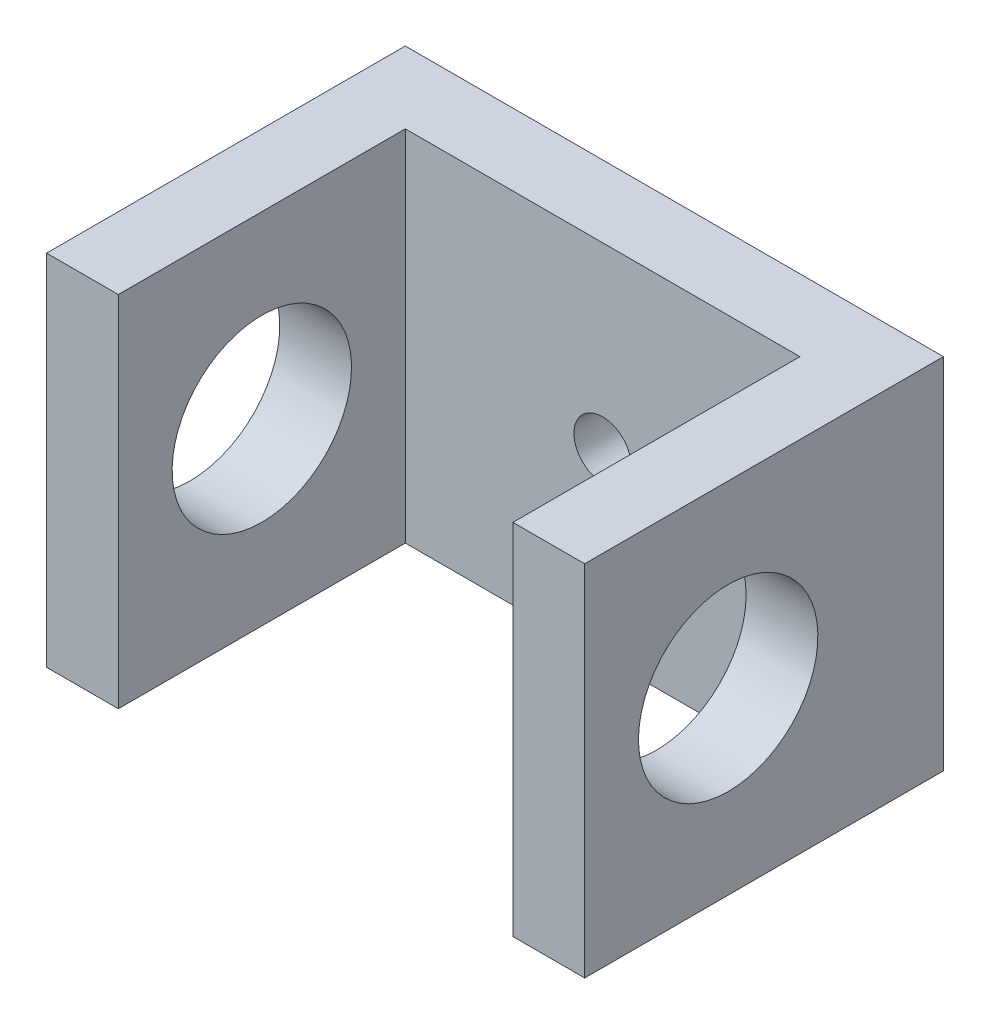
ISO-10303-21;
HEADER;
FILE_DESCRIPTION(('STEP AP214'),'2;1');
FILE_NAME('part.step','',(''),(''),'','','');
FILE_SCHEMA(('AUTOMOTIVE_DESIGN { 1 0 10303 214 1 1 1 1 }'));
ENDSEC;
DATA;
#1=APPLICATION_CONTEXT('core data for automotive mechanical design processes');
#2=APPLICATION_PROTOCOL_DEFINITION('international standard','automotive_design',2000,#1);
#3=PRODUCT_CONTEXT('',#1,'mechanical');
#4=PRODUCT('Part','Part','',(#3));
#5=PRODUCT_RELATED_PRODUCT_CATEGORY('part','',(#4));
#6=PRODUCT_DEFINITION_FORMATION('','',#4);
#7=PRODUCT_DEFINITION_CONTEXT('part definition',#1,'design');
#8=PRODUCT_DEFINITION('design','',#6,#7);
#9=PRODUCT_DEFINITION_SHAPE('','',#8);
#10=(LENGTH_UNIT() NAMED_UNIT(*) SI_UNIT(.MILLI.,.METRE.));
#11=(NAMED_UNIT(*) PLANE_ANGLE_UNIT() SI_UNIT($,.RADIAN.));
#12=(NAMED_UNIT(*) SI_UNIT($,.STERADIAN.) SOLID_ANGLE_UNIT());
#13=UNCERTAINTY_MEASURE_WITH_UNIT(LENGTH_MEASURE(1.E-05),#10,'distance_accuracy_value','');
#14=(GEOMETRIC_REPRESENTATION_CONTEXT(3) GLOBAL_UNCERTAINTY_ASSIGNED_CONTEXT((#13)) GLOBAL_UNIT_ASSIGNED_CONTEXT((#10,
#11,#12)) REPRESENTATION_CONTEXT('',''));
#15=CARTESIAN_POINT('',(0.,0.,0.));
#16=DIRECTION('',(0.,0.,1.));
#17=DIRECTION('',(1.,0.,0.));
#18=AXIS2_PLACEMENT_3D('',#15,#16,#17);
#19=CARTESIAN_POINT('',(0.,0.,2.));
#20=DIRECTION('',(0.,0.,1.));
#21=DIRECTION('',(1.,0.,0.));
#22=AXIS2_PLACEMENT_3D('',#19,#20,#21);
#23=PLANE('',#22);
#24=CARTESIAN_POINT('',(0.,0.,2.));
#25=DIRECTION('',(0.,0.,1.));
#26=DIRECTION('',(1.,0.,0.));
#27=AXIS2_PLACEMENT_3D('',#24,#25,#26);
#28=CIRCLE('',#27,0.8);
#29=CARTESIAN_POINT('',(0.8,0.,2.));
#30=VERTEX_POINT('',#29);
#31=EDGE_CURVE('E321',#30,#30,#28,.T.);
#32=ORIENTED_EDGE('',*,*,#31,.F.);
#33=EDGE_LOOP('',(#32));
#34=FACE_BOUND('',#33,.T.);
#35=DIRECTION('',(1.,0.,0.));
#36=VECTOR('',#35,1.);
#37=CARTESIAN_POINT('',(-7.5,-5.,2.));
#38=LINE('',#37,#36);
#39=CARTESIAN_POINT('',(-5.5,-5.,2.));
#40=VERTEX_POINT('',#39);
#41=CARTESIAN_POINT('',(5.5,-5.,2.));
#42=VERTEX_POINT('',#41);
#43=EDGE_CURVE('E53',#40,#42,#38,.T.);
#44=ORIENTED_EDGE('',*,*,#43,.T.);
#45=DIRECTION('',(0.,-1.,0.));
#46=VECTOR('',#45,1.);
#47=CARTESIAN_POINT('',(5.5,-5.,2.));
#48=LINE('',#47,#46);
#49=CARTESIAN_POINT('',(5.5,5.,2.));
#50=VERTEX_POINT('',#49);
#51=EDGE_CURVE('E48',#50,#42,#48,.T.);
#52=ORIENTED_EDGE('',*,*,#51,.F.);
#53=DIRECTION('',(-1.,0.,0.));
#54=VECTOR('',#53,1.);
#55=CARTESIAN_POINT('',(-7.5,5.,2.));
#56=LINE('',#55,#54);
#57=CARTESIAN_POINT('',(-5.5,5.,2.));
#58=VERTEX_POINT('',#57);
#59=EDGE_CURVE('E147',#50,#58,#56,.T.);
#60=ORIENTED_EDGE('',*,*,#59,.T.);
#61=DIRECTION('',(0.,1.,0.));
#62=VECTOR('',#61,1.);
#63=CARTESIAN_POINT('',(-5.5,-5.,2.));
#64=LINE('',#63,#62);
#65=EDGE_CURVE('E128',#40,#58,#64,.T.);
#66=ORIENTED_EDGE('',*,*,#65,.F.);
#67=EDGE_LOOP('',(#44,#52,#60,#66));
#68=FACE_BOUND('',#67,.T.);
#69=ADVANCED_FACE('F32',(#34,#68),#23,.T.);
#70=CARTESIAN_POINT('',(7.5,5.,2.));
#71=DIRECTION('',(-1.,0.,0.));
#72=DIRECTION('',(0.,-1.,0.));
#73=AXIS2_PLACEMENT_3D('',#70,#71,#72);
#74=PLANE('',#73);
#75=CARTESIAN_POINT('',(7.5,0.,6.));
#76=DIRECTION('',(-1.,0.,0.));
#77=DIRECTION('',(0.,-1.,0.));
#78=AXIS2_PLACEMENT_3D('',#75,#76,#77);
#79=CIRCLE('',#78,2.5);
#80=CARTESIAN_POINT('',(7.5,-2.5,6.));
#81=VERTEX_POINT('',#80);
#82=EDGE_CURVE('E326',#81,#81,#79,.T.);
#83=ORIENTED_EDGE('',*,*,#82,.T.);
#84=EDGE_LOOP('',(#83));
#85=FACE_BOUND('',#84,.T.);
#86=DIRECTION('',(0.,1.,0.));
#87=VECTOR('',#86,1.);
#88=CARTESIAN_POINT('',(7.5,5.,0.));
#89=LINE('',#88,#87);
#90=CARTESIAN_POINT('',(7.5,-5.,0.));
#91=VERTEX_POINT('',#90);
#92=CARTESIAN_POINT('',(7.5,5.,0.));
#93=VERTEX_POINT('',#92);
#94=EDGE_CURVE('E101',#91,#93,#89,.T.);
#95=ORIENTED_EDGE('',*,*,#94,.T.);
#96=DIRECTION('',(0.,0.,-1.));
#97=VECTOR('',#96,1.);
#98=CARTESIAN_POINT('',(7.5,5.,2.));
#99=LINE('',#98,#97);
#100=CARTESIAN_POINT('',(7.5,5.,10.));
#101=VERTEX_POINT('',#100);
#102=EDGE_CURVE('E11',#101,#93,#99,.T.);
#103=ORIENTED_EDGE('',*,*,#102,.F.);
#104=DIRECTION('',(0.,1.,0.));
#105=VECTOR('',#104,1.);
#106=CARTESIAN_POINT('',(7.5,-5.,10.));
#107=LINE('',#106,#105);
#108=CARTESIAN_POINT('',(7.5,-5.,10.));
#109=VERTEX_POINT('',#108);
#110=EDGE_CURVE('E99',#109,#101,#107,.T.);
#111=ORIENTED_EDGE('',*,*,#110,.F.);
#112=DIRECTION('',(0.,0.,-1.));
#113=VECTOR('',#112,1.);
#114=CARTESIAN_POINT('',(7.5,-5.,2.));
#115=LINE('',#114,#113);
#116=EDGE_CURVE('E151',#109,#91,#115,.T.);
#117=ORIENTED_EDGE('',*,*,#116,.T.);
#118=EDGE_LOOP('',(#95,#103,#111,#117));
#119=FACE_BOUND('',#118,.T.);
#120=ADVANCED_FACE('F34',(#85,#119),#74,.F.);
#121=CARTESIAN_POINT('',(-7.5,5.,2.));
#122=DIRECTION('',(0.,-1.,0.));
#123=DIRECTION('',(0.,0.,-1.));
#124=AXIS2_PLACEMENT_3D('',#121,#122,#123);
#125=PLANE('',#124);
#126=DIRECTION('',(-1.,0.,0.));
#127=VECTOR('',#126,1.);
#128=CARTESIAN_POINT('',(-7.5,5.,0.));
#129=LINE('',#128,#127);
#130=CARTESIAN_POINT('',(-7.5,5.,0.));
#131=VERTEX_POINT('',#130);
#132=EDGE_CURVE('E153',#93,#131,#129,.T.);
#133=ORIENTED_EDGE('',*,*,#132,.T.);
#134=DIRECTION('',(0.,0.,-1.));
#135=VECTOR('',#134,1.);
#136=CARTESIAN_POINT('',(-7.5,5.,2.));
#137=LINE('',#136,#135);
#138=CARTESIAN_POINT('',(-7.5,5.,10.));
#139=VERTEX_POINT('',#138);
#140=EDGE_CURVE('E41',#139,#131,#137,.T.);
#141=ORIENTED_EDGE('',*,*,#140,.F.);
#142=DIRECTION('',(-1.,0.,0.));
#143=VECTOR('',#142,1.);
#144=CARTESIAN_POINT('',(-7.5,5.,10.));
#145=LINE('',#144,#143);
#146=CARTESIAN_POINT('',(-5.5,5.,10.));
#147=VERTEX_POINT('',#146);
#148=EDGE_CURVE('E136',#147,#139,#145,.T.);
#149=ORIENTED_EDGE('',*,*,#148,.F.);
#150=DIRECTION('',(0.,0.,-1.));
#151=VECTOR('',#150,1.);
#152=CARTESIAN_POINT('',(-5.5,5.,10.));
#153=LINE('',#152,#151);
#154=EDGE_CURVE('E139',#147,#58,#153,.T.);
#155=ORIENTED_EDGE('',*,*,#154,.T.);
#156=ORIENTED_EDGE('',*,*,#59,.F.);
#157=DIRECTION('',(0.,0.,-1.));
#158=VECTOR('',#157,1.);
#159=CARTESIAN_POINT('',(5.5,5.,10.));
#160=LINE('',#159,#158);
#161=CARTESIAN_POINT('',(5.5,5.,10.));
#162=VERTEX_POINT('',#161);
#163=EDGE_CURVE('E107',#162,#50,#160,.T.);
#164=ORIENTED_EDGE('',*,*,#163,.F.);
#165=DIRECTION('',(-1.,0.,0.));
#166=VECTOR('',#165,1.);
#167=CARTESIAN_POINT('',(7.5,5.,10.));
#168=LINE('',#167,#166);
#169=EDGE_CURVE('E104',#101,#162,#168,.T.);
#170=ORIENTED_EDGE('',*,*,#169,.F.);
#171=ORIENTED_EDGE('',*,*,#102,.T.);
#172=EDGE_LOOP('',(#133,#141,#149,#155,#156,#164,#170,#171));
#173=FACE_BOUND('',#172,.T.);
#174=ADVANCED_FACE('F105',(#173),#125,.F.);
#175=CARTESIAN_POINT('',(-7.5,5.,2.));
#176=DIRECTION('',(1.,0.,0.));
#177=DIRECTION('',(0.,1.,0.));
#178=AXIS2_PLACEMENT_3D('',#175,#176,#177);
#179=PLANE('',#178);
#180=CARTESIAN_POINT('',(-7.5,0.,6.));
#181=DIRECTION('',(-1.,0.,0.));
#182=DIRECTION('',(0.,-1.,0.));
#183=AXIS2_PLACEMENT_3D('',#180,#181,#182);
#184=CIRCLE('',#183,2.5);
#185=CARTESIAN_POINT('',(-7.5,-2.5,6.));
#186=VERTEX_POINT('',#185);
#187=EDGE_CURVE('E323',#186,#186,#184,.T.);
#188=ORIENTED_EDGE('',*,*,#187,.F.);
#189=EDGE_LOOP('',(#188));
#190=FACE_BOUND('',#189,.T.);
#191=DIRECTION('',(0.,-1.,0.));
#192=VECTOR('',#191,1.);
#193=CARTESIAN_POINT('',(-7.5,5.,0.));
#194=LINE('',#193,#192);
#195=CARTESIAN_POINT('',(-7.5,-5.,0.));
#196=VERTEX_POINT('',#195);
#197=EDGE_CURVE('E155',#131,#196,#194,.T.);
#198=ORIENTED_EDGE('',*,*,#197,.T.);
#199=DIRECTION('',(0.,0.,-1.));
#200=VECTOR('',#199,1.);
#201=CARTESIAN_POINT('',(-7.5,-5.,2.));
#202=LINE('',#201,#200);
#203=CARTESIAN_POINT('',(-7.5,-5.,10.));
#204=VERTEX_POINT('',#203);
#205=EDGE_CURVE('E159',#204,#196,#202,.T.);
#206=ORIENTED_EDGE('',*,*,#205,.F.);
#207=DIRECTION('',(0.,-1.,0.));
#208=VECTOR('',#207,1.);
#209=CARTESIAN_POINT('',(-7.5,-5.,10.));
#210=LINE('',#209,#208);
#211=EDGE_CURVE('E129',#139,#204,#210,.T.);
#212=ORIENTED_EDGE('',*,*,#211,.F.);
#213=ORIENTED_EDGE('',*,*,#140,.T.);
#214=EDGE_LOOP('',(#198,#206,#212,#213));
#215=FACE_BOUND('',#214,.T.);
#216=ADVANCED_FACE('F166',(#190,#215),#179,.F.);
#217=CARTESIAN_POINT('',(-7.5,-5.,2.));
#218=DIRECTION('',(0.,1.,0.));
#219=DIRECTION('',(0.,0.,1.));
#220=AXIS2_PLACEMENT_3D('',#217,#218,#219);
#221=PLANE('',#220);
#222=DIRECTION('',(1.,0.,0.));
#223=VECTOR('',#222,1.);
#224=CARTESIAN_POINT('',(-7.5,-5.,0.));
#225=LINE('',#224,#223);
#226=EDGE_CURVE('E149',#196,#91,#225,.T.);
#227=ORIENTED_EDGE('',*,*,#226,.T.);
#228=ORIENTED_EDGE('',*,*,#116,.F.);
#229=DIRECTION('',(1.,0.,0.));
#230=VECTOR('',#229,1.);
#231=CARTESIAN_POINT('',(7.5,-5.,10.));
#232=LINE('',#231,#230);
#233=CARTESIAN_POINT('',(5.5,-5.,10.));
#234=VERTEX_POINT('',#233);
#235=EDGE_CURVE('E115',#234,#109,#232,.T.);
#236=ORIENTED_EDGE('',*,*,#235,.F.);
#237=DIRECTION('',(0.,0.,-1.));
#238=VECTOR('',#237,1.);
#239=CARTESIAN_POINT('',(5.5,-5.,10.));
#240=LINE('',#239,#238);
#241=EDGE_CURVE('E123',#234,#42,#240,.T.);
#242=ORIENTED_EDGE('',*,*,#241,.T.);
#243=ORIENTED_EDGE('',*,*,#43,.F.);
#244=DIRECTION('',(0.,0.,-1.));
#245=VECTOR('',#244,1.);
#246=CARTESIAN_POINT('',(-5.5,-5.,10.));
#247=LINE('',#246,#245);
#248=CARTESIAN_POINT('',(-5.5,-5.,10.));
#249=VERTEX_POINT('',#248);
#250=EDGE_CURVE('E144',#249,#40,#247,.T.);
#251=ORIENTED_EDGE('',*,*,#250,.F.);
#252=DIRECTION('',(1.,0.,0.));
#253=VECTOR('',#252,1.);
#254=CARTESIAN_POINT('',(-7.5,-5.,10.));
#255=LINE('',#254,#253);
#256=EDGE_CURVE('E132',#204,#249,#255,.T.);
#257=ORIENTED_EDGE('',*,*,#256,.F.);
#258=ORIENTED_EDGE('',*,*,#205,.T.);
#259=EDGE_LOOP('',(#227,#228,#236,#242,#243,#251,#257,#258));
#260=FACE_BOUND('',#259,.T.);
#261=ADVANCED_FACE('F172',(#260),#221,.F.);
#262=CARTESIAN_POINT('',(0.,0.,0.));
#263=DIRECTION('',(0.,0.,1.));
#264=DIRECTION('',(1.,0.,0.));
#265=AXIS2_PLACEMENT_3D('',#262,#263,#264);
#266=PLANE('',#265);
#267=CARTESIAN_POINT('',(0.,0.,0.));
#268=DIRECTION('',(0.,0.,1.));
#269=DIRECTION('',(1.,0.,0.));
#270=AXIS2_PLACEMENT_3D('',#267,#268,#269);
#271=CIRCLE('',#270,0.8);
#272=CARTESIAN_POINT('',(0.8,0.,0.));
#273=VERTEX_POINT('',#272);
#274=EDGE_CURVE('E319',#273,#273,#271,.T.);
#275=ORIENTED_EDGE('',*,*,#274,.T.);
#276=EDGE_LOOP('',(#275));
#277=FACE_BOUND('',#276,.T.);
#278=ORIENTED_EDGE('',*,*,#94,.F.);
#279=ORIENTED_EDGE('',*,*,#226,.F.);
#280=ORIENTED_EDGE('',*,*,#197,.F.);
#281=ORIENTED_EDGE('',*,*,#132,.F.);
#282=EDGE_LOOP('',(#278,#279,#280,#281));
#283=FACE_BOUND('',#282,.T.);
#284=ADVANCED_FACE('F170',(#277,#283),#266,.F.);
#285=CARTESIAN_POINT('',(-5.5,-5.,10.));
#286=DIRECTION('',(-1.,0.,0.));
#287=DIRECTION('',(0.,-1.,0.));
#288=AXIS2_PLACEMENT_3D('',#285,#286,#287);
#289=PLANE('',#288);
#290=CARTESIAN_POINT('',(-5.5,0.,6.));
#291=DIRECTION('',(-1.,0.,0.));
#292=DIRECTION('',(0.,-1.,0.));
#293=AXIS2_PLACEMENT_3D('',#290,#291,#292);
#294=CIRCLE('',#293,2.5);
#295=CARTESIAN_POINT('',(-5.5,-2.5,6.));
#296=VERTEX_POINT('',#295);
#297=EDGE_CURVE('E117',#296,#296,#294,.T.);
#298=ORIENTED_EDGE('',*,*,#297,.T.);
#299=EDGE_LOOP('',(#298));
#300=FACE_BOUND('',#299,.T.);
#301=ORIENTED_EDGE('',*,*,#65,.T.);
#302=ORIENTED_EDGE('',*,*,#154,.F.);
#303=DIRECTION('',(0.,1.,0.));
#304=VECTOR('',#303,1.);
#305=CARTESIAN_POINT('',(-5.5,-5.,10.));
#306=LINE('',#305,#304);
#307=EDGE_CURVE('E134',#249,#147,#306,.T.);
#308=ORIENTED_EDGE('',*,*,#307,.F.);
#309=ORIENTED_EDGE('',*,*,#250,.T.);
#310=EDGE_LOOP('',(#301,#302,#308,#309));
#311=FACE_BOUND('',#310,.T.);
#312=ADVANCED_FACE('F180',(#300,#311),#289,.F.);
#313=CARTESIAN_POINT('',(0.,0.,10.));
#314=DIRECTION('',(0.,0.,-1.));
#315=DIRECTION('',(-1.,0.,0.));
#316=AXIS2_PLACEMENT_3D('',#313,#314,#315);
#317=PLANE('',#316);
#318=ORIENTED_EDGE('',*,*,#211,.T.);
#319=ORIENTED_EDGE('',*,*,#256,.T.);
#320=ORIENTED_EDGE('',*,*,#307,.T.);
#321=ORIENTED_EDGE('',*,*,#148,.T.);
#322=EDGE_LOOP('',(#318,#319,#320,#321));
#323=FACE_BOUND('',#322,.T.);
#324=ADVANCED_FACE('F177',(#323),#317,.F.);
#325=CARTESIAN_POINT('',(5.5,-5.,10.));
#326=DIRECTION('',(1.,0.,0.));
#327=DIRECTION('',(0.,0.,-1.));
#328=AXIS2_PLACEMENT_3D('',#325,#326,#327);
#329=PLANE('',#328);
#330=CARTESIAN_POINT('',(5.5,0.,6.));
#331=DIRECTION('',(1.,0.,0.));
#332=DIRECTION('',(0.,0.,-1.));
#333=AXIS2_PLACEMENT_3D('',#330,#331,#332);
#334=CIRCLE('',#333,2.5);
#335=CARTESIAN_POINT('',(5.5,0.,3.5));
#336=VERTEX_POINT('',#335);
#337=EDGE_CURVE('E36',#336,#336,#334,.T.);
#338=ORIENTED_EDGE('',*,*,#337,.T.);
#339=EDGE_LOOP('',(#338));
#340=FACE_BOUND('',#339,.T.);
#341=ORIENTED_EDGE('',*,*,#51,.T.);
#342=ORIENTED_EDGE('',*,*,#241,.F.);
#343=DIRECTION('',(0.,-1.,0.));
#344=VECTOR('',#343,1.);
#345=CARTESIAN_POINT('',(5.5,-5.,10.));
#346=LINE('',#345,#344);
#347=EDGE_CURVE('E110',#162,#234,#346,.T.);
#348=ORIENTED_EDGE('',*,*,#347,.F.);
#349=ORIENTED_EDGE('',*,*,#163,.T.);
#350=EDGE_LOOP('',(#341,#342,#348,#349));
#351=FACE_BOUND('',#350,.T.);
#352=ADVANCED_FACE('F183',(#340,#351),#329,.F.);
#353=CARTESIAN_POINT('',(0.,0.,10.));
#354=DIRECTION('',(0.,0.,1.));
#355=DIRECTION('',(1.,0.,0.));
#356=AXIS2_PLACEMENT_3D('',#353,#354,#355);
#357=PLANE('',#356);
#358=ORIENTED_EDGE('',*,*,#110,.T.);
#359=ORIENTED_EDGE('',*,*,#169,.T.);
#360=ORIENTED_EDGE('',*,*,#347,.T.);
#361=ORIENTED_EDGE('',*,*,#235,.T.);
#362=EDGE_LOOP('',(#358,#359,#360,#361));
#363=FACE_BOUND('',#362,.T.);
#364=ADVANCED_FACE('F113',(#363),#357,.T.);
#365=CARTESIAN_POINT('',(7.5,0.,6.));
#366=DIRECTION('',(-1.,0.,0.));
#367=DIRECTION('',(0.,-1.,0.));
#368=AXIS2_PLACEMENT_3D('',#365,#366,#367);
#369=CYLINDRICAL_SURFACE('',#368,2.5);
#370=ORIENTED_EDGE('',*,*,#82,.F.);
#371=EDGE_LOOP('',(#370));
#372=FACE_BOUND('',#371,.T.);
#373=ORIENTED_EDGE('',*,*,#337,.F.);
#374=EDGE_LOOP('',(#373));
#375=FACE_BOUND('',#374,.T.);
#376=ADVANCED_FACE('F191',(#372,#375),#369,.F.);
#377=ORIENTED_EDGE('',*,*,#187,.T.);
#378=EDGE_LOOP('',(#377));
#379=FACE_BOUND('',#378,.T.);
#380=ORIENTED_EDGE('',*,*,#297,.F.);
#381=EDGE_LOOP('',(#380));
#382=FACE_BOUND('',#381,.T.);
#383=ADVANCED_FACE('F290',(#379,#382),#369,.F.);
#384=CARTESIAN_POINT('',(0.,0.,0.));
#385=DIRECTION('',(0.,0.,1.));
#386=DIRECTION('',(1.,0.,0.));
#387=AXIS2_PLACEMENT_3D('',#384,#385,#386);
#388=CYLINDRICAL_SURFACE('',#387,0.8);
#389=ORIENTED_EDGE('',*,*,#274,.F.);
#390=EDGE_LOOP('',(#389));
#391=FACE_BOUND('',#390,.T.);
#392=ORIENTED_EDGE('',*,*,#31,.T.);
#393=EDGE_LOOP('',(#392));
#394=FACE_BOUND('',#393,.T.);
#395=ADVANCED_FACE('F295',(#391,#394),#388,.F.);
#396=CLOSED_SHELL('',(#69,#120,#174,#216,#261,#284,#312,#324,#352,#364,#376,#383,#395));
#397=MANIFOLD_SOLID_BREP('B2',#396);
#398=ADVANCED_BREP_SHAPE_REPRESENTATION('',(#18,#397),#14);
#399=SHAPE_DEFINITION_REPRESENTATION(#9,#398);
ENDSEC;
END-ISO-10303-21;
